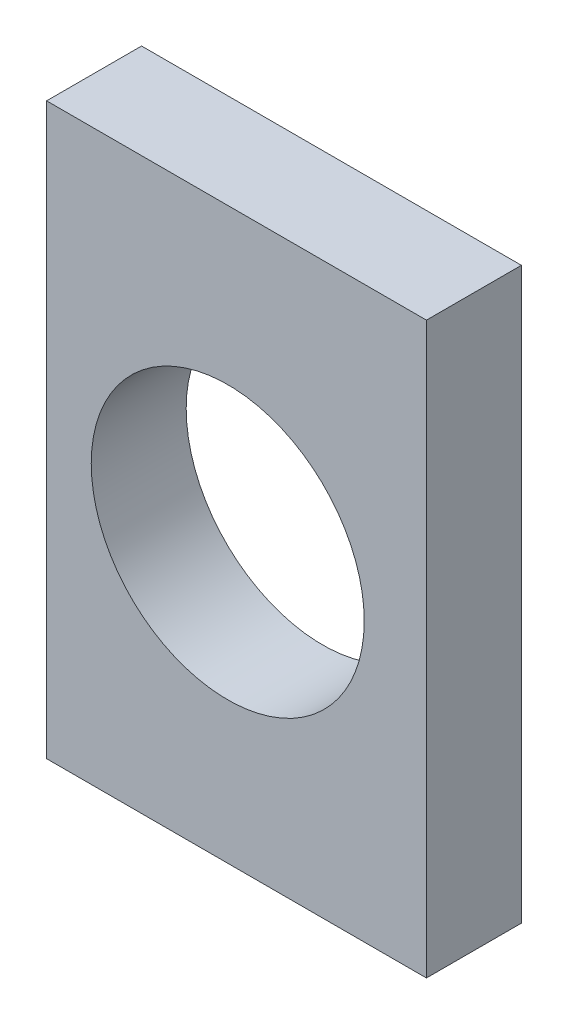
ISO-10303-21;
HEADER;
FILE_DESCRIPTION(('STEP AP214'),'2;1');
FILE_NAME('part.step','',(''),(''),'','','');
FILE_SCHEMA(('AUTOMOTIVE_DESIGN { 1 0 10303 214 1 1 1 1 }'));
ENDSEC;
DATA;
#1=APPLICATION_CONTEXT('core data for automotive mechanical design processes');
#2=APPLICATION_PROTOCOL_DEFINITION('international standard','automotive_design',2000,#1);
#3=PRODUCT_CONTEXT('',#1,'mechanical');
#4=PRODUCT('Part','Part','',(#3));
#5=PRODUCT_RELATED_PRODUCT_CATEGORY('part','',(#4));
#6=PRODUCT_DEFINITION_FORMATION('','',#4);
#7=PRODUCT_DEFINITION_CONTEXT('part definition',#1,'design');
#8=PRODUCT_DEFINITION('design','',#6,#7);
#9=PRODUCT_DEFINITION_SHAPE('','',#8);
#10=(LENGTH_UNIT() NAMED_UNIT(*) SI_UNIT(.MILLI.,.METRE.));
#11=(NAMED_UNIT(*) PLANE_ANGLE_UNIT() SI_UNIT($,.RADIAN.));
#12=(NAMED_UNIT(*) SI_UNIT($,.STERADIAN.) SOLID_ANGLE_UNIT());
#13=UNCERTAINTY_MEASURE_WITH_UNIT(LENGTH_MEASURE(1.E-05),#10,'distance_accuracy_value','');
#14=(GEOMETRIC_REPRESENTATION_CONTEXT(3) GLOBAL_UNCERTAINTY_ASSIGNED_CONTEXT((#13)) GLOBAL_UNIT_ASSIGNED_CONTEXT((#10,
#11,#12)) REPRESENTATION_CONTEXT('',''));
#15=CARTESIAN_POINT('',(0.,0.,0.));
#16=DIRECTION('',(0.,0.,1.));
#17=DIRECTION('',(1.,0.,0.));
#18=AXIS2_PLACEMENT_3D('',#15,#16,#17);
#19=CARTESIAN_POINT('',(0.,0.,4.));
#20=DIRECTION('',(0.,0.,1.));
#21=DIRECTION('',(1.,0.,0.));
#22=AXIS2_PLACEMENT_3D('',#19,#20,#21);
#23=PLANE('',#22);
#24=DIRECTION('',(0.,-1.,0.));
#25=VECTOR('',#24,1.);
#26=CARTESIAN_POINT('',(-1.75,17.5,4.));
#27=LINE('',#26,#25);
#28=CARTESIAN_POINT('',(-1.75,17.5,4.));
#29=VERTEX_POINT('',#28);
#30=CARTESIAN_POINT('',(-1.75,-6.5,4.));
#31=VERTEX_POINT('',#30);
#32=EDGE_CURVE('E89',#29,#31,#27,.T.);
#33=ORIENTED_EDGE('',*,*,#32,.T.);
#34=DIRECTION('',(1.,0.,0.));
#35=VECTOR('',#34,1.);
#36=CARTESIAN_POINT('',(-1.75,-6.5,4.));
#37=LINE('',#36,#35);
#38=CARTESIAN_POINT('',(14.25,-6.5,4.));
#39=VERTEX_POINT('',#38);
#40=EDGE_CURVE('E84',#31,#39,#37,.T.);
#41=ORIENTED_EDGE('',*,*,#40,.T.);
#42=DIRECTION('',(0.,1.,0.));
#43=VECTOR('',#42,1.);
#44=CARTESIAN_POINT('',(14.25,17.5,4.));
#45=LINE('',#44,#43);
#46=CARTESIAN_POINT('',(14.25,17.5,4.));
#47=VERTEX_POINT('',#46);
#48=EDGE_CURVE('E87',#39,#47,#45,.T.);
#49=ORIENTED_EDGE('',*,*,#48,.T.);
#50=DIRECTION('',(-1.,0.,0.));
#51=VECTOR('',#50,1.);
#52=CARTESIAN_POINT('',(-1.75,17.5,4.));
#53=LINE('',#52,#51);
#54=EDGE_CURVE('E54',#47,#29,#53,.T.);
#55=ORIENTED_EDGE('',*,*,#54,.T.);
#56=EDGE_LOOP('',(#33,#41,#49,#55));
#57=FACE_BOUND('',#56,.T.);
#58=CARTESIAN_POINT('',(5.87973754425,5.212858194,4.));
#59=DIRECTION('',(0.,0.,1.));
#60=DIRECTION('',(1.,0.,0.));
#61=AXIS2_PLACEMENT_3D('',#58,#59,#60);
#62=CIRCLE('',#61,5.75);
#63=CARTESIAN_POINT('',(11.62973754425,5.212858194,4.));
#64=VERTEX_POINT('',#63);
#65=EDGE_CURVE('E104',#64,#64,#62,.T.);
#66=ORIENTED_EDGE('',*,*,#65,.F.);
#67=EDGE_LOOP('',(#66));
#68=FACE_BOUND('',#67,.T.);
#69=ADVANCED_FACE('F37',(#57,#68),#23,.T.);
#70=CARTESIAN_POINT('',(0.,0.,0.));
#71=DIRECTION('',(0.,0.,1.));
#72=DIRECTION('',(1.,0.,0.));
#73=AXIS2_PLACEMENT_3D('',#70,#71,#72);
#74=PLANE('',#73);
#75=DIRECTION('',(0.,-1.,0.));
#76=VECTOR('',#75,1.);
#77=CARTESIAN_POINT('',(-1.75,17.5,0.));
#78=LINE('',#77,#76);
#79=CARTESIAN_POINT('',(-1.75,17.5,0.));
#80=VERTEX_POINT('',#79);
#81=CARTESIAN_POINT('',(-1.75,-6.5,0.));
#82=VERTEX_POINT('',#81);
#83=EDGE_CURVE('E101',#80,#82,#78,.T.);
#84=ORIENTED_EDGE('',*,*,#83,.F.);
#85=DIRECTION('',(-1.,0.,0.));
#86=VECTOR('',#85,1.);
#87=CARTESIAN_POINT('',(-1.75,17.5,0.));
#88=LINE('',#87,#86);
#89=CARTESIAN_POINT('',(14.25,17.5,0.));
#90=VERTEX_POINT('',#89);
#91=EDGE_CURVE('E77',#90,#80,#88,.T.);
#92=ORIENTED_EDGE('',*,*,#91,.F.);
#93=DIRECTION('',(0.,1.,0.));
#94=VECTOR('',#93,1.);
#95=CARTESIAN_POINT('',(14.25,17.5,0.));
#96=LINE('',#95,#94);
#97=CARTESIAN_POINT('',(14.25,-6.5,0.));
#98=VERTEX_POINT('',#97);
#99=EDGE_CURVE('E71',#98,#90,#96,.T.);
#100=ORIENTED_EDGE('',*,*,#99,.F.);
#101=DIRECTION('',(1.,0.,0.));
#102=VECTOR('',#101,1.);
#103=CARTESIAN_POINT('',(-1.75,-6.5,0.));
#104=LINE('',#103,#102);
#105=EDGE_CURVE('E93',#82,#98,#104,.T.);
#106=ORIENTED_EDGE('',*,*,#105,.F.);
#107=EDGE_LOOP('',(#84,#92,#100,#106));
#108=FACE_BOUND('',#107,.T.);
#109=CARTESIAN_POINT('',(5.87973754425,5.212858194,0.));
#110=DIRECTION('',(0.,0.,1.));
#111=DIRECTION('',(1.,0.,0.));
#112=AXIS2_PLACEMENT_3D('',#109,#110,#111);
#113=CIRCLE('',#112,5.75);
#114=CARTESIAN_POINT('',(11.62973754425,5.212858194,0.));
#115=VERTEX_POINT('',#114);
#116=EDGE_CURVE('E116',#115,#115,#113,.T.);
#117=ORIENTED_EDGE('',*,*,#116,.T.);
#118=EDGE_LOOP('',(#117));
#119=FACE_BOUND('',#118,.T.);
#120=ADVANCED_FACE('F112',(#108,#119),#74,.F.);
#121=CARTESIAN_POINT('',(-1.75,17.5,4.));
#122=DIRECTION('',(1.,0.,0.));
#123=DIRECTION('',(0.,1.,0.));
#124=AXIS2_PLACEMENT_3D('',#121,#122,#123);
#125=PLANE('',#124);
#126=ORIENTED_EDGE('',*,*,#83,.T.);
#127=DIRECTION('',(0.,0.,-1.));
#128=VECTOR('',#127,1.);
#129=CARTESIAN_POINT('',(-1.75,-6.5,4.));
#130=LINE('',#129,#128);
#131=EDGE_CURVE('E11',#31,#82,#130,.T.);
#132=ORIENTED_EDGE('',*,*,#131,.F.);
#133=ORIENTED_EDGE('',*,*,#32,.F.);
#134=DIRECTION('',(0.,0.,-1.));
#135=VECTOR('',#134,1.);
#136=CARTESIAN_POINT('',(-1.75,17.5,4.));
#137=LINE('',#136,#135);
#138=EDGE_CURVE('E97',#29,#80,#137,.T.);
#139=ORIENTED_EDGE('',*,*,#138,.T.);
#140=EDGE_LOOP('',(#126,#132,#133,#139));
#141=FACE_BOUND('',#140,.T.);
#142=ADVANCED_FACE('F39',(#141),#125,.F.);
#143=CARTESIAN_POINT('',(-1.75,-6.5,4.));
#144=DIRECTION('',(0.,1.,0.));
#145=DIRECTION('',(0.,0.,1.));
#146=AXIS2_PLACEMENT_3D('',#143,#144,#145);
#147=PLANE('',#146);
#148=ORIENTED_EDGE('',*,*,#105,.T.);
#149=DIRECTION('',(0.,0.,-1.));
#150=VECTOR('',#149,1.);
#151=CARTESIAN_POINT('',(14.25,-6.5,4.));
#152=LINE('',#151,#150);
#153=EDGE_CURVE('E46',#39,#98,#152,.T.);
#154=ORIENTED_EDGE('',*,*,#153,.F.);
#155=ORIENTED_EDGE('',*,*,#40,.F.);
#156=ORIENTED_EDGE('',*,*,#131,.T.);
#157=EDGE_LOOP('',(#148,#154,#155,#156));
#158=FACE_BOUND('',#157,.T.);
#159=ADVANCED_FACE('F92',(#158),#147,.F.);
#160=CARTESIAN_POINT('',(14.25,17.5,4.));
#161=DIRECTION('',(-1.,0.,0.));
#162=DIRECTION('',(0.,0.,1.));
#163=AXIS2_PLACEMENT_3D('',#160,#161,#162);
#164=PLANE('',#163);
#165=ORIENTED_EDGE('',*,*,#99,.T.);
#166=DIRECTION('',(0.,0.,-1.));
#167=VECTOR('',#166,1.);
#168=CARTESIAN_POINT('',(14.25,17.5,4.));
#169=LINE('',#168,#167);
#170=EDGE_CURVE('E94',#47,#90,#169,.T.);
#171=ORIENTED_EDGE('',*,*,#170,.F.);
#172=ORIENTED_EDGE('',*,*,#48,.F.);
#173=ORIENTED_EDGE('',*,*,#153,.T.);
#174=EDGE_LOOP('',(#165,#171,#172,#173));
#175=FACE_BOUND('',#174,.T.);
#176=ADVANCED_FACE('F95',(#175),#164,.F.);
#177=CARTESIAN_POINT('',(-1.75,17.5,4.));
#178=DIRECTION('',(0.,-1.,0.));
#179=DIRECTION('',(0.,0.,-1.));
#180=AXIS2_PLACEMENT_3D('',#177,#178,#179);
#181=PLANE('',#180);
#182=ORIENTED_EDGE('',*,*,#91,.T.);
#183=ORIENTED_EDGE('',*,*,#138,.F.);
#184=ORIENTED_EDGE('',*,*,#54,.F.);
#185=ORIENTED_EDGE('',*,*,#170,.T.);
#186=EDGE_LOOP('',(#182,#183,#184,#185));
#187=FACE_BOUND('',#186,.T.);
#188=ADVANCED_FACE('F109',(#187),#181,.F.);
#189=CARTESIAN_POINT('',(5.87973754425,5.212858194,4.));
#190=DIRECTION('',(0.,0.,-1.));
#191=DIRECTION('',(-1.,0.,0.));
#192=AXIS2_PLACEMENT_3D('',#189,#190,#191);
#193=CYLINDRICAL_SURFACE('',#192,5.75);
#194=ORIENTED_EDGE('',*,*,#65,.T.);
#195=EDGE_LOOP('',(#194));
#196=FACE_BOUND('',#195,.T.);
#197=ORIENTED_EDGE('',*,*,#116,.F.);
#198=EDGE_LOOP('',(#197));
#199=FACE_BOUND('',#198,.T.);
#200=ADVANCED_FACE('F122',(#196,#199),#193,.F.);
#201=CLOSED_SHELL('',(#69,#120,#142,#159,#176,#188,#200));
#202=MANIFOLD_SOLID_BREP('B2',#201);
#203=ADVANCED_BREP_SHAPE_REPRESENTATION('',(#18,#202),#14);
#204=SHAPE_DEFINITION_REPRESENTATION(#9,#203);
ENDSEC;
END-ISO-10303-21;
